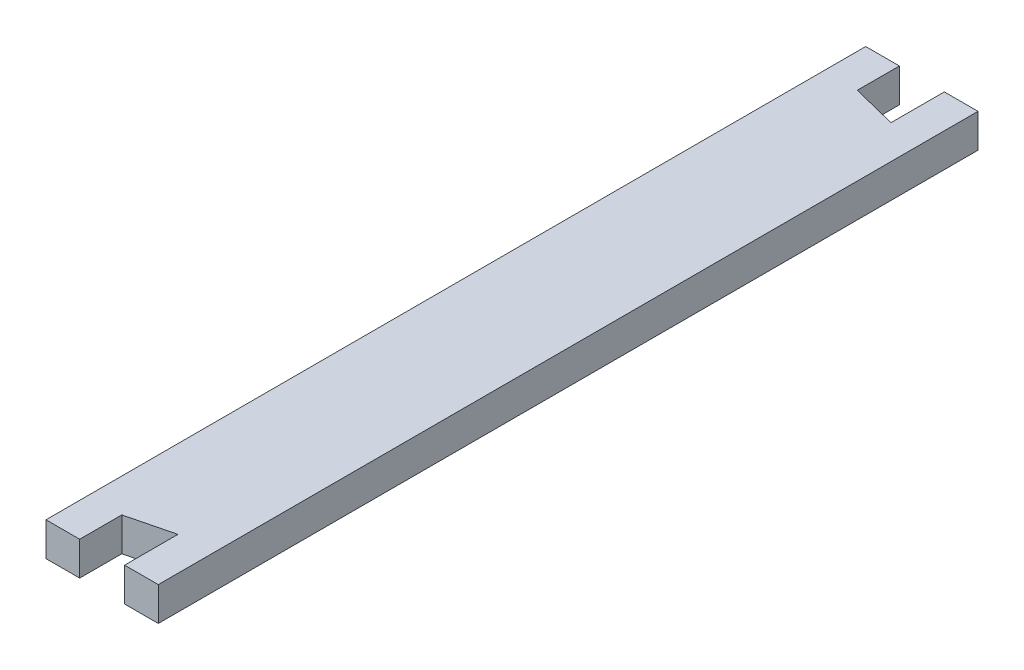
ISO-10303-21;
HEADER;
FILE_DESCRIPTION(('STEP AP214'),'2;1');
FILE_NAME('part.step','',(''),(''),'','','');
FILE_SCHEMA(('AUTOMOTIVE_DESIGN { 1 0 10303 214 1 1 1 1 }'));
ENDSEC;
DATA;
#1=APPLICATION_CONTEXT('core data for automotive mechanical design processes');
#2=APPLICATION_PROTOCOL_DEFINITION('international standard','automotive_design',2000,#1);
#3=PRODUCT_CONTEXT('',#1,'mechanical');
#4=PRODUCT('Part','Part','',(#3));
#5=PRODUCT_RELATED_PRODUCT_CATEGORY('part','',(#4));
#6=PRODUCT_DEFINITION_FORMATION('','',#4);
#7=PRODUCT_DEFINITION_CONTEXT('part definition',#1,'design');
#8=PRODUCT_DEFINITION('design','',#6,#7);
#9=PRODUCT_DEFINITION_SHAPE('','',#8);
#10=(LENGTH_UNIT() NAMED_UNIT(*) SI_UNIT(.MILLI.,.METRE.));
#11=(NAMED_UNIT(*) PLANE_ANGLE_UNIT() SI_UNIT($,.RADIAN.));
#12=(NAMED_UNIT(*) SI_UNIT($,.STERADIAN.) SOLID_ANGLE_UNIT());
#13=UNCERTAINTY_MEASURE_WITH_UNIT(LENGTH_MEASURE(1.E-05),#10,'distance_accuracy_value','');
#14=(GEOMETRIC_REPRESENTATION_CONTEXT(3) GLOBAL_UNCERTAINTY_ASSIGNED_CONTEXT((#13)) GLOBAL_UNIT_ASSIGNED_CONTEXT((#10,
#11,#12)) REPRESENTATION_CONTEXT('',''));
#15=CARTESIAN_POINT('',(0.,0.,0.));
#16=DIRECTION('',(0.,0.,1.));
#17=DIRECTION('',(1.,0.,0.));
#18=AXIS2_PLACEMENT_3D('',#15,#16,#17);
#19=CARTESIAN_POINT('',(0.,0.,0.));
#20=DIRECTION('',(0.,1.,0.));
#21=DIRECTION('',(0.,0.,1.));
#22=AXIS2_PLACEMENT_3D('',#19,#20,#21);
#23=PLANE('',#22);
#24=DIRECTION('',(0.,0.,1.));
#25=VECTOR('',#24,1.);
#26=CARTESIAN_POINT('',(-99.9999999999999,0.,0.));
#27=LINE('',#26,#25);
#28=CARTESIAN_POINT('',(-99.9999999999999,0.,-182.5));
#29=VERTEX_POINT('',#28);
#30=CARTESIAN_POINT('',(-99.9999999999999,0.,182.5));
#31=VERTEX_POINT('',#30);
#32=EDGE_CURVE('E157',#29,#31,#27,.T.);
#33=ORIENTED_EDGE('',*,*,#32,.T.);
#34=DIRECTION('',(-1.,0.,0.));
#35=VECTOR('',#34,1.);
#36=CARTESIAN_POINT('',(0.,0.,182.5));
#37=LINE('',#36,#35);
#38=CARTESIAN_POINT('',(-115.,0.,182.5));
#39=VERTEX_POINT('',#38);
#40=EDGE_CURVE('E213',#31,#39,#37,.T.);
#41=ORIENTED_EDGE('',*,*,#40,.T.);
#42=DIRECTION('',(0.,0.,-1.));
#43=VECTOR('',#42,1.);
#44=CARTESIAN_POINT('',(-115.,0.,-1.34395418770413E-13));
#45=LINE('',#44,#43);
#46=CARTESIAN_POINT('',(-115.,0.,158.75));
#47=VERTEX_POINT('',#46);
#48=EDGE_CURVE('E216',#39,#47,#45,.T.);
#49=ORIENTED_EDGE('',*,*,#48,.T.);
#50=DIRECTION('',(0.970142500145332,0.,-0.242535625036333));
#51=VECTOR('',#50,1.);
#52=CARTESIAN_POINT('',(30.5882352941177,0.,122.352941176471));
#53=LINE('',#52,#51);
#54=CARTESIAN_POINT('',(-135.,0.,163.75));
#55=VERTEX_POINT('',#54);
#56=EDGE_CURVE('E219',#55,#47,#53,.T.);
#57=ORIENTED_EDGE('',*,*,#56,.F.);
#58=DIRECTION('',(0.,0.,-1.));
#59=VECTOR('',#58,1.);
#60=CARTESIAN_POINT('',(-135.,0.,3.99680288865059E-13));
#61=LINE('',#60,#59);
#62=CARTESIAN_POINT('',(-135.,0.,182.5));
#63=VERTEX_POINT('',#62);
#64=EDGE_CURVE('E222',#63,#55,#61,.T.);
#65=ORIENTED_EDGE('',*,*,#64,.F.);
#66=DIRECTION('',(1.,0.,0.));
#67=VECTOR('',#66,1.);
#68=CARTESIAN_POINT('',(3.37692836656818E-13,0.,182.5));
#69=LINE('',#68,#67);
#70=CARTESIAN_POINT('',(-150.,0.,182.5));
#71=VERTEX_POINT('',#70);
#72=EDGE_CURVE('E225',#71,#63,#69,.T.);
#73=ORIENTED_EDGE('',*,*,#72,.F.);
#74=DIRECTION('',(0.,0.,-1.));
#75=VECTOR('',#74,1.);
#76=CARTESIAN_POINT('',(-150.,0.,0.));
#77=LINE('',#76,#75);
#78=CARTESIAN_POINT('',(-150.,0.,-182.5));
#79=VERTEX_POINT('',#78);
#80=EDGE_CURVE('E261',#71,#79,#77,.T.);
#81=ORIENTED_EDGE('',*,*,#80,.T.);
#82=DIRECTION('',(1.,0.,0.));
#83=VECTOR('',#82,1.);
#84=CARTESIAN_POINT('',(3.37692836656818E-13,0.,-182.5));
#85=LINE('',#84,#83);
#86=CARTESIAN_POINT('',(-135.,0.,-182.5));
#87=VERTEX_POINT('',#86);
#88=EDGE_CURVE('E228',#79,#87,#85,.T.);
#89=ORIENTED_EDGE('',*,*,#88,.T.);
#90=DIRECTION('',(0.,0.,1.));
#91=VECTOR('',#90,1.);
#92=CARTESIAN_POINT('',(-135.,0.,-3.99680288865059E-13));
#93=LINE('',#92,#91);
#94=CARTESIAN_POINT('',(-135.,0.,-163.75));
#95=VERTEX_POINT('',#94);
#96=EDGE_CURVE('E231',#87,#95,#93,.T.);
#97=ORIENTED_EDGE('',*,*,#96,.T.);
#98=DIRECTION('',(-0.970142500145332,0.,-0.242535625036332));
#99=VECTOR('',#98,1.);
#100=CARTESIAN_POINT('',(30.5882352941176,0.,-122.352941176471));
#101=LINE('',#100,#99);
#102=CARTESIAN_POINT('',(-115.,0.,-158.75));
#103=VERTEX_POINT('',#102);
#104=EDGE_CURVE('E234',#103,#95,#101,.T.);
#105=ORIENTED_EDGE('',*,*,#104,.F.);
#106=DIRECTION('',(0.,0.,1.));
#107=VECTOR('',#106,1.);
#108=CARTESIAN_POINT('',(-115.,0.,1.34395418770413E-13));
#109=LINE('',#108,#107);
#110=CARTESIAN_POINT('',(-115.,0.,-182.5));
#111=VERTEX_POINT('',#110);
#112=EDGE_CURVE('E192',#111,#103,#109,.T.);
#113=ORIENTED_EDGE('',*,*,#112,.F.);
#114=DIRECTION('',(-1.,0.,0.));
#115=VECTOR('',#114,1.);
#116=CARTESIAN_POINT('',(0.,0.,-182.5));
#117=LINE('',#116,#115);
#118=EDGE_CURVE('E237',#29,#111,#117,.T.);
#119=ORIENTED_EDGE('',*,*,#118,.F.);
#120=EDGE_LOOP('',(#33,#41,#49,#57,#65,#73,#81,#89,#97,#105,#113,#119));
#121=FACE_BOUND('',#120,.T.);
#122=ADVANCED_FACE('F95',(#121),#23,.F.);
#123=CARTESIAN_POINT('',(0.,15.,0.));
#124=DIRECTION('',(0.,1.,0.));
#125=DIRECTION('',(0.,0.,1.));
#126=AXIS2_PLACEMENT_3D('',#123,#124,#125);
#127=PLANE('',#126);
#128=DIRECTION('',(-1.,0.,0.));
#129=VECTOR('',#128,1.);
#130=CARTESIAN_POINT('',(0.,15.,182.5));
#131=LINE('',#130,#129);
#132=CARTESIAN_POINT('',(-99.9999999999999,15.,182.5));
#133=VERTEX_POINT('',#132);
#134=CARTESIAN_POINT('',(-115.,15.,182.5));
#135=VERTEX_POINT('',#134);
#136=EDGE_CURVE('E239',#133,#135,#131,.T.);
#137=ORIENTED_EDGE('',*,*,#136,.F.);
#138=DIRECTION('',(0.,0.,1.));
#139=VECTOR('',#138,1.);
#140=CARTESIAN_POINT('',(-99.9999999999999,15.,-155.));
#141=LINE('',#140,#139);
#142=CARTESIAN_POINT('',(-99.9999999999999,15.,-182.5));
#143=VERTEX_POINT('',#142);
#144=EDGE_CURVE('E12',#143,#133,#141,.T.);
#145=ORIENTED_EDGE('',*,*,#144,.F.);
#146=DIRECTION('',(-1.,0.,0.));
#147=VECTOR('',#146,1.);
#148=CARTESIAN_POINT('',(0.,15.,-182.5));
#149=LINE('',#148,#147);
#150=CARTESIAN_POINT('',(-115.,15.,-182.5));
#151=VERTEX_POINT('',#150);
#152=EDGE_CURVE('E207',#143,#151,#149,.T.);
#153=ORIENTED_EDGE('',*,*,#152,.T.);
#154=DIRECTION('',(0.,0.,1.));
#155=VECTOR('',#154,1.);
#156=CARTESIAN_POINT('',(-115.,15.,1.34395418770413E-13));
#157=LINE('',#156,#155);
#158=CARTESIAN_POINT('',(-115.,15.,-158.75));
#159=VERTEX_POINT('',#158);
#160=EDGE_CURVE('E190',#151,#159,#157,.T.);
#161=ORIENTED_EDGE('',*,*,#160,.T.);
#162=DIRECTION('',(-0.970142500145332,0.,-0.242535625036332));
#163=VECTOR('',#162,1.);
#164=CARTESIAN_POINT('',(30.5882352941176,15.,-122.352941176471));
#165=LINE('',#164,#163);
#166=CARTESIAN_POINT('',(-135.,15.,-163.75));
#167=VERTEX_POINT('',#166);
#168=EDGE_CURVE('E200',#159,#167,#165,.T.);
#169=ORIENTED_EDGE('',*,*,#168,.T.);
#170=DIRECTION('',(0.,0.,1.));
#171=VECTOR('',#170,1.);
#172=CARTESIAN_POINT('',(-135.,15.,-3.99680288865059E-13));
#173=LINE('',#172,#171);
#174=CARTESIAN_POINT('',(-135.,15.,-182.5));
#175=VERTEX_POINT('',#174);
#176=EDGE_CURVE('E203',#175,#167,#173,.T.);
#177=ORIENTED_EDGE('',*,*,#176,.F.);
#178=DIRECTION('',(1.,0.,0.));
#179=VECTOR('',#178,1.);
#180=CARTESIAN_POINT('',(3.37692836656818E-13,15.,-182.5));
#181=LINE('',#180,#179);
#182=CARTESIAN_POINT('',(-150.,15.,-182.5));
#183=VERTEX_POINT('',#182);
#184=EDGE_CURVE('E274',#183,#175,#181,.T.);
#185=ORIENTED_EDGE('',*,*,#184,.F.);
#186=DIRECTION('',(0.,0.,-1.));
#187=VECTOR('',#186,1.);
#188=CARTESIAN_POINT('',(-150.,15.,-167.5));
#189=LINE('',#188,#187);
#190=CARTESIAN_POINT('',(-150.,15.,182.5));
#191=VERTEX_POINT('',#190);
#192=EDGE_CURVE('E99',#191,#183,#189,.T.);
#193=ORIENTED_EDGE('',*,*,#192,.F.);
#194=DIRECTION('',(1.,0.,0.));
#195=VECTOR('',#194,1.);
#196=CARTESIAN_POINT('',(3.37692836656818E-13,15.,182.5));
#197=LINE('',#196,#195);
#198=CARTESIAN_POINT('',(-135.,15.,182.5));
#199=VERTEX_POINT('',#198);
#200=EDGE_CURVE('E276',#191,#199,#197,.T.);
#201=ORIENTED_EDGE('',*,*,#200,.T.);
#202=DIRECTION('',(0.,0.,-1.));
#203=VECTOR('',#202,1.);
#204=CARTESIAN_POINT('',(-135.,15.,3.99680288865059E-13));
#205=LINE('',#204,#203);
#206=CARTESIAN_POINT('',(-135.,15.,163.75));
#207=VERTEX_POINT('',#206);
#208=EDGE_CURVE('E278',#199,#207,#205,.T.);
#209=ORIENTED_EDGE('',*,*,#208,.T.);
#210=DIRECTION('',(0.970142500145332,0.,-0.242535625036333));
#211=VECTOR('',#210,1.);
#212=CARTESIAN_POINT('',(30.5882352941177,15.,122.352941176471));
#213=LINE('',#212,#211);
#214=CARTESIAN_POINT('',(-115.,15.,158.75));
#215=VERTEX_POINT('',#214);
#216=EDGE_CURVE('E283',#207,#215,#213,.T.);
#217=ORIENTED_EDGE('',*,*,#216,.T.);
#218=DIRECTION('',(0.,0.,-1.));
#219=VECTOR('',#218,1.);
#220=CARTESIAN_POINT('',(-115.,15.,-1.34395418770413E-13));
#221=LINE('',#220,#219);
#222=EDGE_CURVE('E286',#135,#215,#221,.T.);
#223=ORIENTED_EDGE('',*,*,#222,.F.);
#224=EDGE_LOOP('',(#137,#145,#153,#161,#169,#177,#185,#193,#201,#209,#217,#223));
#225=FACE_BOUND('',#224,.T.);
#226=ADVANCED_FACE('F205',(#225),#127,.T.);
#227=CARTESIAN_POINT('',(-150.,-40.,-167.5));
#228=DIRECTION('',(1.,0.,0.));
#229=DIRECTION('',(0.,0.,-1.));
#230=AXIS2_PLACEMENT_3D('',#227,#228,#229);
#231=PLANE('',#230);
#232=ORIENTED_EDGE('',*,*,#80,.F.);
#233=DIRECTION('',(0.,-1.,0.));
#234=VECTOR('',#233,1.);
#235=CARTESIAN_POINT('',(-150.,15.,182.5));
#236=LINE('',#235,#234);
#237=EDGE_CURVE('E248',#191,#71,#236,.T.);
#238=ORIENTED_EDGE('',*,*,#237,.F.);
#239=ORIENTED_EDGE('',*,*,#192,.T.);
#240=DIRECTION('',(0.,-1.,0.));
#241=VECTOR('',#240,1.);
#242=CARTESIAN_POINT('',(-150.,15.,-182.5));
#243=LINE('',#242,#241);
#244=EDGE_CURVE('E245',#183,#79,#243,.T.);
#245=ORIENTED_EDGE('',*,*,#244,.T.);
#246=EDGE_LOOP('',(#232,#238,#239,#245));
#247=FACE_BOUND('',#246,.T.);
#248=ADVANCED_FACE('F97',(#247),#231,.F.);
#249=CARTESIAN_POINT('',(-99.9999999999999,-40.,-155.));
#250=DIRECTION('',(-1.,0.,0.));
#251=DIRECTION('',(0.,0.,1.));
#252=AXIS2_PLACEMENT_3D('',#249,#250,#251);
#253=PLANE('',#252);
#254=ORIENTED_EDGE('',*,*,#144,.T.);
#255=DIRECTION('',(0.,-1.,0.));
#256=VECTOR('',#255,1.);
#257=CARTESIAN_POINT('',(-99.9999999999999,15.,182.5));
#258=LINE('',#257,#256);
#259=EDGE_CURVE('E259',#133,#31,#258,.T.);
#260=ORIENTED_EDGE('',*,*,#259,.T.);
#261=ORIENTED_EDGE('',*,*,#32,.F.);
#262=DIRECTION('',(0.,-1.,0.));
#263=VECTOR('',#262,1.);
#264=CARTESIAN_POINT('',(-99.9999999999999,15.,-182.5));
#265=LINE('',#264,#263);
#266=EDGE_CURVE('E209',#143,#29,#265,.T.);
#267=ORIENTED_EDGE('',*,*,#266,.F.);
#268=EDGE_LOOP('',(#254,#260,#261,#267));
#269=FACE_BOUND('',#268,.T.);
#270=ADVANCED_FACE('F311',(#269),#253,.F.);
#271=CARTESIAN_POINT('',(0.,15.,-182.5));
#272=DIRECTION('',(0.,0.,1.));
#273=DIRECTION('',(1.,0.,0.));
#274=AXIS2_PLACEMENT_3D('',#271,#272,#273);
#275=PLANE('',#274);
#276=ORIENTED_EDGE('',*,*,#118,.T.);
#277=DIRECTION('',(0.,-1.,0.));
#278=VECTOR('',#277,1.);
#279=CARTESIAN_POINT('',(-115.,15.,-182.5));
#280=LINE('',#279,#278);
#281=EDGE_CURVE('E151',#151,#111,#280,.T.);
#282=ORIENTED_EDGE('',*,*,#281,.F.);
#283=ORIENTED_EDGE('',*,*,#152,.F.);
#284=ORIENTED_EDGE('',*,*,#266,.T.);
#285=EDGE_LOOP('',(#276,#282,#283,#284));
#286=FACE_BOUND('',#285,.T.);
#287=ADVANCED_FACE('F313',(#286),#275,.F.);
#288=CARTESIAN_POINT('',(-115.,15.,1.34395418770413E-13));
#289=DIRECTION('',(1.,0.,0.));
#290=DIRECTION('',(0.,0.,-1.));
#291=AXIS2_PLACEMENT_3D('',#288,#289,#290);
#292=PLANE('',#291);
#293=ORIENTED_EDGE('',*,*,#112,.T.);
#294=DIRECTION('',(0.,-1.,0.));
#295=VECTOR('',#294,1.);
#296=CARTESIAN_POINT('',(-115.,15.,-158.75));
#297=LINE('',#296,#295);
#298=EDGE_CURVE('E186',#159,#103,#297,.T.);
#299=ORIENTED_EDGE('',*,*,#298,.F.);
#300=ORIENTED_EDGE('',*,*,#160,.F.);
#301=ORIENTED_EDGE('',*,*,#281,.T.);
#302=EDGE_LOOP('',(#293,#299,#300,#301));
#303=FACE_BOUND('',#302,.T.);
#304=ADVANCED_FACE('F188',(#303),#292,.F.);
#305=CARTESIAN_POINT('',(30.5882352941176,15.,-122.352941176471));
#306=DIRECTION('',(-0.242535625036332,0.,0.970142500145332));
#307=DIRECTION('',(0.970142500145332,0.,0.242535625036332));
#308=AXIS2_PLACEMENT_3D('',#305,#306,#307);
#309=PLANE('',#308);
#310=ORIENTED_EDGE('',*,*,#104,.T.);
#311=DIRECTION('',(0.,-1.,0.));
#312=VECTOR('',#311,1.);
#313=CARTESIAN_POINT('',(-135.,15.,-163.75));
#314=LINE('',#313,#312);
#315=EDGE_CURVE('E196',#167,#95,#314,.T.);
#316=ORIENTED_EDGE('',*,*,#315,.F.);
#317=ORIENTED_EDGE('',*,*,#168,.F.);
#318=ORIENTED_EDGE('',*,*,#298,.T.);
#319=EDGE_LOOP('',(#310,#316,#317,#318));
#320=FACE_BOUND('',#319,.T.);
#321=ADVANCED_FACE('F201',(#320),#309,.F.);
#322=CARTESIAN_POINT('',(-135.,15.,-3.99680288865059E-13));
#323=DIRECTION('',(1.,0.,0.));
#324=DIRECTION('',(0.,0.,-1.));
#325=AXIS2_PLACEMENT_3D('',#322,#323,#324);
#326=PLANE('',#325);
#327=ORIENTED_EDGE('',*,*,#96,.F.);
#328=DIRECTION('',(0.,-1.,0.));
#329=VECTOR('',#328,1.);
#330=CARTESIAN_POINT('',(-135.,15.,-182.5));
#331=LINE('',#330,#329);
#332=EDGE_CURVE('E243',#175,#87,#331,.T.);
#333=ORIENTED_EDGE('',*,*,#332,.F.);
#334=ORIENTED_EDGE('',*,*,#176,.T.);
#335=ORIENTED_EDGE('',*,*,#315,.T.);
#336=EDGE_LOOP('',(#327,#333,#334,#335));
#337=FACE_BOUND('',#336,.T.);
#338=ADVANCED_FACE('F390',(#337),#326,.T.);
#339=CARTESIAN_POINT('',(3.37692836656818E-13,15.,-182.5));
#340=DIRECTION('',(0.,0.,-1.));
#341=DIRECTION('',(-1.,0.,0.));
#342=AXIS2_PLACEMENT_3D('',#339,#340,#341);
#343=PLANE('',#342);
#344=ORIENTED_EDGE('',*,*,#88,.F.);
#345=ORIENTED_EDGE('',*,*,#244,.F.);
#346=ORIENTED_EDGE('',*,*,#184,.T.);
#347=ORIENTED_EDGE('',*,*,#332,.T.);
#348=EDGE_LOOP('',(#344,#345,#346,#347));
#349=FACE_BOUND('',#348,.T.);
#350=ADVANCED_FACE('F273',(#349),#343,.T.);
#351=CARTESIAN_POINT('',(0.,15.,182.5));
#352=DIRECTION('',(0.,0.,1.));
#353=DIRECTION('',(1.,0.,0.));
#354=AXIS2_PLACEMENT_3D('',#351,#352,#353);
#355=PLANE('',#354);
#356=ORIENTED_EDGE('',*,*,#40,.F.);
#357=ORIENTED_EDGE('',*,*,#259,.F.);
#358=ORIENTED_EDGE('',*,*,#136,.T.);
#359=DIRECTION('',(0.,-1.,0.));
#360=VECTOR('',#359,1.);
#361=CARTESIAN_POINT('',(-115.,15.,182.5));
#362=LINE('',#361,#360);
#363=EDGE_CURVE('E257',#135,#39,#362,.T.);
#364=ORIENTED_EDGE('',*,*,#363,.T.);
#365=EDGE_LOOP('',(#356,#357,#358,#364));
#366=FACE_BOUND('',#365,.T.);
#367=ADVANCED_FACE('F291',(#366),#355,.T.);
#368=CARTESIAN_POINT('',(-115.,15.,-1.34395418770413E-13));
#369=DIRECTION('',(-1.,0.,0.));
#370=DIRECTION('',(0.,0.,1.));
#371=AXIS2_PLACEMENT_3D('',#368,#369,#370);
#372=PLANE('',#371);
#373=ORIENTED_EDGE('',*,*,#48,.F.);
#374=ORIENTED_EDGE('',*,*,#363,.F.);
#375=ORIENTED_EDGE('',*,*,#222,.T.);
#376=DIRECTION('',(0.,-1.,0.));
#377=VECTOR('',#376,1.);
#378=CARTESIAN_POINT('',(-115.,15.,158.75));
#379=LINE('',#378,#377);
#380=EDGE_CURVE('E255',#215,#47,#379,.T.);
#381=ORIENTED_EDGE('',*,*,#380,.T.);
#382=EDGE_LOOP('',(#373,#374,#375,#381));
#383=FACE_BOUND('',#382,.T.);
#384=ADVANCED_FACE('F295',(#383),#372,.T.);
#385=CARTESIAN_POINT('',(30.5882352941177,15.,122.352941176471));
#386=DIRECTION('',(-0.242535625036333,0.,-0.970142500145332));
#387=DIRECTION('',(-0.970142500145332,0.,0.242535625036333));
#388=AXIS2_PLACEMENT_3D('',#385,#386,#387);
#389=PLANE('',#388);
#390=ORIENTED_EDGE('',*,*,#56,.T.);
#391=ORIENTED_EDGE('',*,*,#380,.F.);
#392=ORIENTED_EDGE('',*,*,#216,.F.);
#393=DIRECTION('',(0.,-1.,0.));
#394=VECTOR('',#393,1.);
#395=CARTESIAN_POINT('',(-135.,15.,163.75));
#396=LINE('',#395,#394);
#397=EDGE_CURVE('E253',#207,#55,#396,.T.);
#398=ORIENTED_EDGE('',*,*,#397,.T.);
#399=EDGE_LOOP('',(#390,#391,#392,#398));
#400=FACE_BOUND('',#399,.T.);
#401=ADVANCED_FACE('F300',(#400),#389,.F.);
#402=CARTESIAN_POINT('',(-135.,15.,3.99680288865059E-13));
#403=DIRECTION('',(-1.,0.,0.));
#404=DIRECTION('',(0.,0.,1.));
#405=AXIS2_PLACEMENT_3D('',#402,#403,#404);
#406=PLANE('',#405);
#407=ORIENTED_EDGE('',*,*,#64,.T.);
#408=ORIENTED_EDGE('',*,*,#397,.F.);
#409=ORIENTED_EDGE('',*,*,#208,.F.);
#410=DIRECTION('',(0.,-1.,0.));
#411=VECTOR('',#410,1.);
#412=CARTESIAN_POINT('',(-135.,15.,182.5));
#413=LINE('',#412,#411);
#414=EDGE_CURVE('E251',#199,#63,#413,.T.);
#415=ORIENTED_EDGE('',*,*,#414,.T.);
#416=EDGE_LOOP('',(#407,#408,#409,#415));
#417=FACE_BOUND('',#416,.T.);
#418=ADVANCED_FACE('F425',(#417),#406,.F.);
#419=CARTESIAN_POINT('',(3.37692836656818E-13,15.,182.5));
#420=DIRECTION('',(0.,0.,-1.));
#421=DIRECTION('',(-1.,0.,0.));
#422=AXIS2_PLACEMENT_3D('',#419,#420,#421);
#423=PLANE('',#422);
#424=ORIENTED_EDGE('',*,*,#72,.T.);
#425=ORIENTED_EDGE('',*,*,#414,.F.);
#426=ORIENTED_EDGE('',*,*,#200,.F.);
#427=ORIENTED_EDGE('',*,*,#237,.T.);
#428=EDGE_LOOP('',(#424,#425,#426,#427));
#429=FACE_BOUND('',#428,.T.);
#430=ADVANCED_FACE('F433',(#429),#423,.F.);
#431=CLOSED_SHELL('',(#122,#226,#248,#270,#287,#304,#321,#338,#350,#367,#384,#401,#418,#430));
#432=MANIFOLD_SOLID_BREP('B2',#431);
#433=ADVANCED_BREP_SHAPE_REPRESENTATION('',(#18,#432),#14);
#434=SHAPE_DEFINITION_REPRESENTATION(#9,#433);
ENDSEC;
END-ISO-10303-21;
